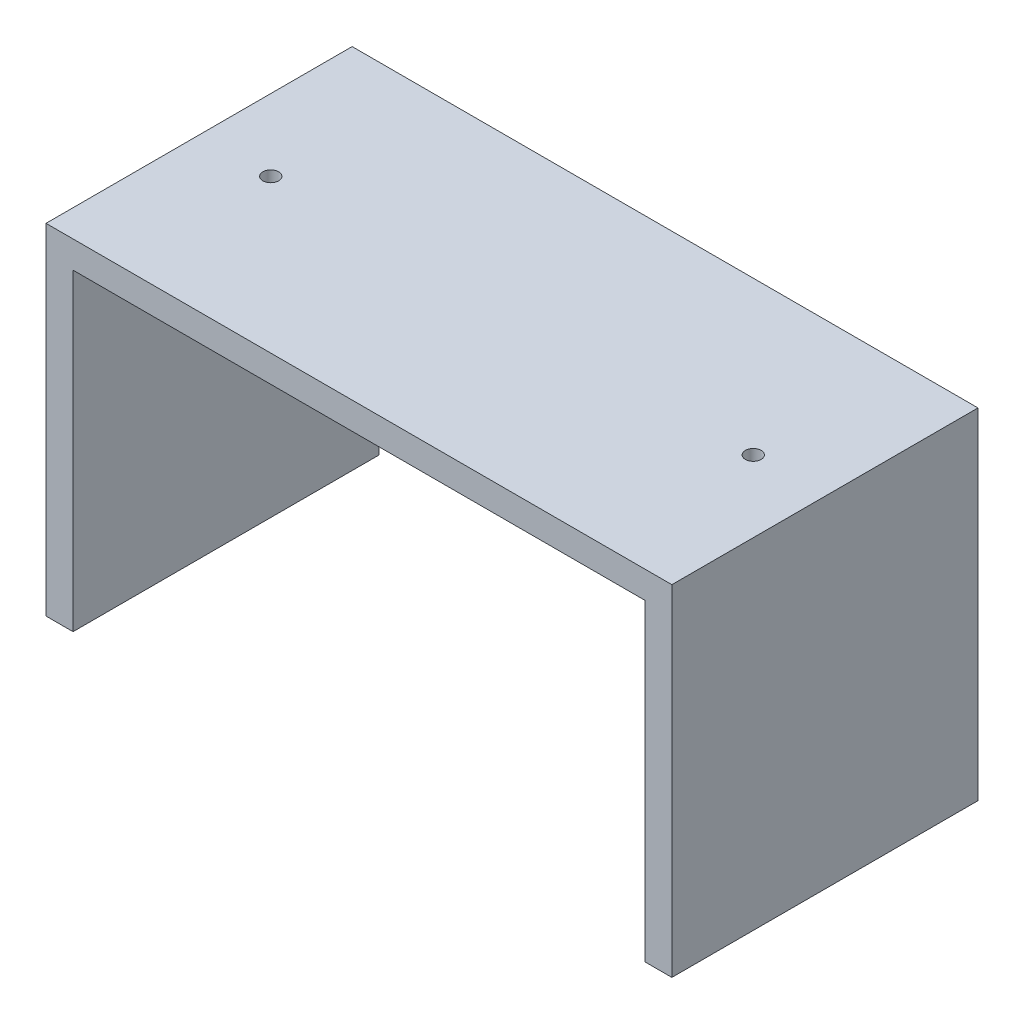
ISO-10303-21;
HEADER;
FILE_DESCRIPTION(('STEP AP214'),'2;1');
FILE_NAME('part.step','',(''),(''),'','','');
FILE_SCHEMA(('AUTOMOTIVE_DESIGN { 1 0 10303 214 1 1 1 1 }'));
ENDSEC;
DATA;
#1=APPLICATION_CONTEXT('core data for automotive mechanical design processes');
#2=APPLICATION_PROTOCOL_DEFINITION('international standard','automotive_design',2000,#1);
#3=PRODUCT_CONTEXT('',#1,'mechanical');
#4=PRODUCT('Part','Part','',(#3));
#5=PRODUCT_RELATED_PRODUCT_CATEGORY('part','',(#4));
#6=PRODUCT_DEFINITION_FORMATION('','',#4);
#7=PRODUCT_DEFINITION_CONTEXT('part definition',#1,'design');
#8=PRODUCT_DEFINITION('design','',#6,#7);
#9=PRODUCT_DEFINITION_SHAPE('','',#8);
#10=(LENGTH_UNIT() NAMED_UNIT(*) SI_UNIT(.MILLI.,.METRE.));
#11=(NAMED_UNIT(*) PLANE_ANGLE_UNIT() SI_UNIT($,.RADIAN.));
#12=(NAMED_UNIT(*) SI_UNIT($,.STERADIAN.) SOLID_ANGLE_UNIT());
#13=UNCERTAINTY_MEASURE_WITH_UNIT(LENGTH_MEASURE(1.E-05),#10,'distance_accuracy_value','');
#14=(GEOMETRIC_REPRESENTATION_CONTEXT(3) GLOBAL_UNCERTAINTY_ASSIGNED_CONTEXT((#13)) GLOBAL_UNIT_ASSIGNED_CONTEXT((#10,
#11,#12)) REPRESENTATION_CONTEXT('',''));
#15=CARTESIAN_POINT('',(0.,0.,0.));
#16=DIRECTION('',(0.,0.,1.));
#17=DIRECTION('',(1.,0.,0.));
#18=AXIS2_PLACEMENT_3D('',#15,#16,#17);
#19=CARTESIAN_POINT('',(0.,-20.,18.));
#20=DIRECTION('',(0.,1.,0.));
#21=DIRECTION('',(0.,0.,1.));
#22=AXIS2_PLACEMENT_3D('',#19,#20,#21);
#23=PLANE('',#22);
#24=DIRECTION('',(1.,0.,0.));
#25=VECTOR('',#24,1.);
#26=CARTESIAN_POINT('',(0.,-20.,0.));
#27=LINE('',#26,#25);
#28=CARTESIAN_POINT('',(0.,-20.,0.));
#29=VERTEX_POINT('',#28);
#30=CARTESIAN_POINT('',(1.59,-20.,0.));
#31=VERTEX_POINT('',#30);
#32=EDGE_CURVE('E128',#29,#31,#27,.T.);
#33=ORIENTED_EDGE('',*,*,#32,.T.);
#34=DIRECTION('',(0.,0.,-1.));
#35=VECTOR('',#34,1.);
#36=CARTESIAN_POINT('',(1.59,-20.,18.));
#37=LINE('',#36,#35);
#38=CARTESIAN_POINT('',(1.59,-20.,18.));
#39=VERTEX_POINT('',#38);
#40=EDGE_CURVE('E11',#39,#31,#37,.T.);
#41=ORIENTED_EDGE('',*,*,#40,.F.);
#42=DIRECTION('',(1.,0.,0.));
#43=VECTOR('',#42,1.);
#44=CARTESIAN_POINT('',(0.,-20.,18.));
#45=LINE('',#44,#43);
#46=CARTESIAN_POINT('',(0.,-20.,18.));
#47=VERTEX_POINT('',#46);
#48=EDGE_CURVE('E143',#47,#39,#45,.T.);
#49=ORIENTED_EDGE('',*,*,#48,.F.);
#50=DIRECTION('',(0.,0.,-1.));
#51=VECTOR('',#50,1.);
#52=CARTESIAN_POINT('',(0.,-20.,18.));
#53=LINE('',#52,#51);
#54=EDGE_CURVE('E124',#47,#29,#53,.T.);
#55=ORIENTED_EDGE('',*,*,#54,.T.);
#56=EDGE_LOOP('',(#33,#41,#49,#55));
#57=FACE_BOUND('',#56,.T.);
#58=ADVANCED_FACE('F32',(#57),#23,.F.);
#59=CARTESIAN_POINT('',(1.59,-20.,18.));
#60=DIRECTION('',(-1.,0.,0.));
#61=DIRECTION('',(0.,0.,1.));
#62=AXIS2_PLACEMENT_3D('',#59,#60,#61);
#63=PLANE('',#62);
#64=DIRECTION('',(0.,1.,0.));
#65=VECTOR('',#64,1.);
#66=CARTESIAN_POINT('',(1.59,-20.,0.));
#67=LINE('',#66,#65);
#68=CARTESIAN_POINT('',(1.59,-1.59,0.));
#69=VERTEX_POINT('',#68);
#70=EDGE_CURVE('E131',#31,#69,#67,.T.);
#71=ORIENTED_EDGE('',*,*,#70,.T.);
#72=DIRECTION('',(0.,0.,-1.));
#73=VECTOR('',#72,1.);
#74=CARTESIAN_POINT('',(1.59,-1.59,18.));
#75=LINE('',#74,#73);
#76=CARTESIAN_POINT('',(1.59,-1.59,18.));
#77=VERTEX_POINT('',#76);
#78=EDGE_CURVE('E40',#77,#69,#75,.T.);
#79=ORIENTED_EDGE('',*,*,#78,.F.);
#80=DIRECTION('',(0.,1.,0.));
#81=VECTOR('',#80,1.);
#82=CARTESIAN_POINT('',(1.59,-20.,18.));
#83=LINE('',#82,#81);
#84=EDGE_CURVE('E91',#39,#77,#83,.T.);
#85=ORIENTED_EDGE('',*,*,#84,.F.);
#86=ORIENTED_EDGE('',*,*,#40,.T.);
#87=EDGE_LOOP('',(#71,#79,#85,#86));
#88=FACE_BOUND('',#87,.T.);
#89=ADVANCED_FACE('F204',(#88),#63,.F.);
#90=CARTESIAN_POINT('',(1.59,-1.59,18.));
#91=DIRECTION('',(0.,1.,0.));
#92=DIRECTION('',(0.,0.,1.));
#93=AXIS2_PLACEMENT_3D('',#90,#91,#92);
#94=PLANE('',#93);
#95=CARTESIAN_POINT('',(32.5859,-1.59,9.));
#96=DIRECTION('',(0.,1.,0.));
#97=DIRECTION('',(0.,0.,1.));
#98=AXIS2_PLACEMENT_3D('',#95,#96,#97);
#99=CIRCLE('',#98,0.463549999999997);
#100=CARTESIAN_POINT('',(32.5859,-1.59,9.46355));
#101=VERTEX_POINT('',#100);
#102=EDGE_CURVE('E181',#101,#101,#99,.T.);
#103=ORIENTED_EDGE('',*,*,#102,.T.);
#104=EDGE_LOOP('',(#103));
#105=FACE_BOUND('',#104,.T.);
#106=CARTESIAN_POINT('',(4.2141,-1.59,9.));
#107=DIRECTION('',(0.,1.,0.));
#108=DIRECTION('',(0.,0.,1.));
#109=AXIS2_PLACEMENT_3D('',#106,#107,#108);
#110=CIRCLE('',#109,0.46355);
#111=CARTESIAN_POINT('',(4.2141,-1.59,9.46355));
#112=VERTEX_POINT('',#111);
#113=EDGE_CURVE('E132',#112,#112,#110,.T.);
#114=ORIENTED_EDGE('',*,*,#113,.T.);
#115=EDGE_LOOP('',(#114));
#116=FACE_BOUND('',#115,.T.);
#117=DIRECTION('',(1.,0.,0.));
#118=VECTOR('',#117,1.);
#119=CARTESIAN_POINT('',(1.59,-1.59,0.));
#120=LINE('',#119,#118);
#121=CARTESIAN_POINT('',(35.21,-1.59,0.));
#122=VERTEX_POINT('',#121);
#123=EDGE_CURVE('E134',#69,#122,#120,.T.);
#124=ORIENTED_EDGE('',*,*,#123,.T.);
#125=DIRECTION('',(0.,0.,-1.));
#126=VECTOR('',#125,1.);
#127=CARTESIAN_POINT('',(35.21,-1.59,18.));
#128=LINE('',#127,#126);
#129=CARTESIAN_POINT('',(35.21,-1.59,18.));
#130=VERTEX_POINT('',#129);
#131=EDGE_CURVE('E150',#130,#122,#128,.T.);
#132=ORIENTED_EDGE('',*,*,#131,.F.);
#133=DIRECTION('',(1.,0.,0.));
#134=VECTOR('',#133,1.);
#135=CARTESIAN_POINT('',(1.59,-1.59,18.));
#136=LINE('',#135,#134);
#137=EDGE_CURVE('E158',#77,#130,#136,.T.);
#138=ORIENTED_EDGE('',*,*,#137,.F.);
#139=ORIENTED_EDGE('',*,*,#78,.T.);
#140=EDGE_LOOP('',(#124,#132,#138,#139));
#141=FACE_BOUND('',#140,.T.);
#142=ADVANCED_FACE('F156',(#105,#116,#141),#94,.F.);
#143=CARTESIAN_POINT('',(35.21,-1.59,18.));
#144=DIRECTION('',(1.,0.,0.));
#145=DIRECTION('',(0.,0.,-1.));
#146=AXIS2_PLACEMENT_3D('',#143,#144,#145);
#147=PLANE('',#146);
#148=DIRECTION('',(0.,-1.,0.));
#149=VECTOR('',#148,1.);
#150=CARTESIAN_POINT('',(35.21,-1.59,0.));
#151=LINE('',#150,#149);
#152=CARTESIAN_POINT('',(35.21,-20.,0.));
#153=VERTEX_POINT('',#152);
#154=EDGE_CURVE('E136',#122,#153,#151,.T.);
#155=ORIENTED_EDGE('',*,*,#154,.T.);
#156=DIRECTION('',(0.,0.,-1.));
#157=VECTOR('',#156,1.);
#158=CARTESIAN_POINT('',(35.21,-20.,18.));
#159=LINE('',#158,#157);
#160=CARTESIAN_POINT('',(35.21,-20.,18.));
#161=VERTEX_POINT('',#160);
#162=EDGE_CURVE('E147',#161,#153,#159,.T.);
#163=ORIENTED_EDGE('',*,*,#162,.F.);
#164=DIRECTION('',(0.,-1.,0.));
#165=VECTOR('',#164,1.);
#166=CARTESIAN_POINT('',(35.21,-1.59,18.));
#167=LINE('',#166,#165);
#168=EDGE_CURVE('E170',#130,#161,#167,.T.);
#169=ORIENTED_EDGE('',*,*,#168,.F.);
#170=ORIENTED_EDGE('',*,*,#131,.T.);
#171=EDGE_LOOP('',(#155,#163,#169,#170));
#172=FACE_BOUND('',#171,.T.);
#173=ADVANCED_FACE('F166',(#172),#147,.F.);
#174=CARTESIAN_POINT('',(35.21,-20.,18.));
#175=DIRECTION('',(0.,1.,0.));
#176=DIRECTION('',(0.,0.,1.));
#177=AXIS2_PLACEMENT_3D('',#174,#175,#176);
#178=PLANE('',#177);
#179=DIRECTION('',(1.,0.,0.));
#180=VECTOR('',#179,1.);
#181=CARTESIAN_POINT('',(35.21,-20.,0.));
#182=LINE('',#181,#180);
#183=CARTESIAN_POINT('',(36.8,-20.,0.));
#184=VERTEX_POINT('',#183);
#185=EDGE_CURVE('E138',#153,#184,#182,.T.);
#186=ORIENTED_EDGE('',*,*,#185,.T.);
#187=DIRECTION('',(0.,0.,-1.));
#188=VECTOR('',#187,1.);
#189=CARTESIAN_POINT('',(36.8,-20.,18.));
#190=LINE('',#189,#188);
#191=CARTESIAN_POINT('',(36.8,-20.,18.));
#192=VERTEX_POINT('',#191);
#193=EDGE_CURVE('E119',#192,#184,#190,.T.);
#194=ORIENTED_EDGE('',*,*,#193,.F.);
#195=DIRECTION('',(1.,0.,0.));
#196=VECTOR('',#195,1.);
#197=CARTESIAN_POINT('',(35.21,-20.,18.));
#198=LINE('',#197,#196);
#199=EDGE_CURVE('E110',#161,#192,#198,.T.);
#200=ORIENTED_EDGE('',*,*,#199,.F.);
#201=ORIENTED_EDGE('',*,*,#162,.T.);
#202=EDGE_LOOP('',(#186,#194,#200,#201));
#203=FACE_BOUND('',#202,.T.);
#204=ADVANCED_FACE('F169',(#203),#178,.F.);
#205=CARTESIAN_POINT('',(36.8,0.,18.));
#206=DIRECTION('',(-1.,0.,0.));
#207=DIRECTION('',(0.,0.,1.));
#208=AXIS2_PLACEMENT_3D('',#205,#206,#207);
#209=PLANE('',#208);
#210=DIRECTION('',(0.,1.,0.));
#211=VECTOR('',#210,1.);
#212=CARTESIAN_POINT('',(36.8,0.,0.));
#213=LINE('',#212,#211);
#214=CARTESIAN_POINT('',(36.8,0.,0.));
#215=VERTEX_POINT('',#214);
#216=EDGE_CURVE('E118',#184,#215,#213,.T.);
#217=ORIENTED_EDGE('',*,*,#216,.T.);
#218=DIRECTION('',(0.,0.,-1.));
#219=VECTOR('',#218,1.);
#220=CARTESIAN_POINT('',(36.8,0.,18.));
#221=LINE('',#220,#219);
#222=CARTESIAN_POINT('',(36.8,0.,18.));
#223=VERTEX_POINT('',#222);
#224=EDGE_CURVE('E115',#223,#215,#221,.T.);
#225=ORIENTED_EDGE('',*,*,#224,.F.);
#226=DIRECTION('',(0.,1.,0.));
#227=VECTOR('',#226,1.);
#228=CARTESIAN_POINT('',(36.8,0.,18.));
#229=LINE('',#228,#227);
#230=EDGE_CURVE('E104',#192,#223,#229,.T.);
#231=ORIENTED_EDGE('',*,*,#230,.F.);
#232=ORIENTED_EDGE('',*,*,#193,.T.);
#233=EDGE_LOOP('',(#217,#225,#231,#232));
#234=FACE_BOUND('',#233,.T.);
#235=ADVANCED_FACE('F116',(#234),#209,.F.);
#236=CARTESIAN_POINT('',(0.,0.,18.));
#237=DIRECTION('',(0.,-1.,0.));
#238=DIRECTION('',(0.,0.,-1.));
#239=AXIS2_PLACEMENT_3D('',#236,#237,#238);
#240=PLANE('',#239);
#241=CARTESIAN_POINT('',(32.5859,0.,9.));
#242=DIRECTION('',(0.,1.,0.));
#243=DIRECTION('',(0.,0.,1.));
#244=AXIS2_PLACEMENT_3D('',#241,#242,#243);
#245=CIRCLE('',#244,0.463549999999997);
#246=CARTESIAN_POINT('',(32.5859,0.,9.46355));
#247=VERTEX_POINT('',#246);
#248=EDGE_CURVE('E184',#247,#247,#245,.T.);
#249=ORIENTED_EDGE('',*,*,#248,.F.);
#250=EDGE_LOOP('',(#249));
#251=FACE_BOUND('',#250,.T.);
#252=CARTESIAN_POINT('',(4.2141,0.,9.));
#253=DIRECTION('',(0.,1.,0.));
#254=DIRECTION('',(0.,0.,1.));
#255=AXIS2_PLACEMENT_3D('',#252,#253,#254);
#256=CIRCLE('',#255,0.46355);
#257=CARTESIAN_POINT('',(4.2141,0.,9.46355));
#258=VERTEX_POINT('',#257);
#259=EDGE_CURVE('E178',#258,#258,#256,.T.);
#260=ORIENTED_EDGE('',*,*,#259,.F.);
#261=EDGE_LOOP('',(#260));
#262=FACE_BOUND('',#261,.T.);
#263=DIRECTION('',(-1.,0.,0.));
#264=VECTOR('',#263,1.);
#265=CARTESIAN_POINT('',(0.,0.,0.));
#266=LINE('',#265,#264);
#267=CARTESIAN_POINT('',(0.,0.,0.));
#268=VERTEX_POINT('',#267);
#269=EDGE_CURVE('E77',#215,#268,#266,.T.);
#270=ORIENTED_EDGE('',*,*,#269,.T.);
#271=DIRECTION('',(0.,0.,-1.));
#272=VECTOR('',#271,1.);
#273=CARTESIAN_POINT('',(0.,0.,18.));
#274=LINE('',#273,#272);
#275=CARTESIAN_POINT('',(0.,0.,18.));
#276=VERTEX_POINT('',#275);
#277=EDGE_CURVE('E120',#276,#268,#274,.T.);
#278=ORIENTED_EDGE('',*,*,#277,.F.);
#279=DIRECTION('',(-1.,0.,0.));
#280=VECTOR('',#279,1.);
#281=CARTESIAN_POINT('',(0.,0.,18.));
#282=LINE('',#281,#280);
#283=EDGE_CURVE('E108',#223,#276,#282,.T.);
#284=ORIENTED_EDGE('',*,*,#283,.F.);
#285=ORIENTED_EDGE('',*,*,#224,.T.);
#286=EDGE_LOOP('',(#270,#278,#284,#285));
#287=FACE_BOUND('',#286,.T.);
#288=ADVANCED_FACE('F122',(#251,#262,#287),#240,.F.);
#289=CARTESIAN_POINT('',(0.,-20.,18.));
#290=DIRECTION('',(1.,0.,0.));
#291=DIRECTION('',(0.,0.,-1.));
#292=AXIS2_PLACEMENT_3D('',#289,#290,#291);
#293=PLANE('',#292);
#294=DIRECTION('',(0.,-1.,0.));
#295=VECTOR('',#294,1.);
#296=CARTESIAN_POINT('',(0.,-20.,0.));
#297=LINE('',#296,#295);
#298=EDGE_CURVE('E83',#268,#29,#297,.T.);
#299=ORIENTED_EDGE('',*,*,#298,.T.);
#300=ORIENTED_EDGE('',*,*,#54,.F.);
#301=DIRECTION('',(0.,-1.,0.));
#302=VECTOR('',#301,1.);
#303=CARTESIAN_POINT('',(0.,-20.,18.));
#304=LINE('',#303,#302);
#305=EDGE_CURVE('E48',#276,#47,#304,.T.);
#306=ORIENTED_EDGE('',*,*,#305,.F.);
#307=ORIENTED_EDGE('',*,*,#277,.T.);
#308=EDGE_LOOP('',(#299,#300,#306,#307));
#309=FACE_BOUND('',#308,.T.);
#310=ADVANCED_FACE('F193',(#309),#293,.F.);
#311=CARTESIAN_POINT('',(0.,0.,18.));
#312=DIRECTION('',(0.,0.,1.));
#313=DIRECTION('',(1.,0.,0.));
#314=AXIS2_PLACEMENT_3D('',#311,#312,#313);
#315=PLANE('',#314);
#316=ORIENTED_EDGE('',*,*,#48,.T.);
#317=ORIENTED_EDGE('',*,*,#84,.T.);
#318=ORIENTED_EDGE('',*,*,#137,.T.);
#319=ORIENTED_EDGE('',*,*,#168,.T.);
#320=ORIENTED_EDGE('',*,*,#199,.T.);
#321=ORIENTED_EDGE('',*,*,#230,.T.);
#322=ORIENTED_EDGE('',*,*,#283,.T.);
#323=ORIENTED_EDGE('',*,*,#305,.T.);
#324=EDGE_LOOP('',(#316,#317,#318,#319,#320,#321,#322,#323));
#325=FACE_BOUND('',#324,.T.);
#326=ADVANCED_FACE('F106',(#325),#315,.T.);
#327=CARTESIAN_POINT('',(0.,0.,0.));
#328=DIRECTION('',(0.,0.,1.));
#329=DIRECTION('',(1.,0.,0.));
#330=AXIS2_PLACEMENT_3D('',#327,#328,#329);
#331=PLANE('',#330);
#332=ORIENTED_EDGE('',*,*,#32,.F.);
#333=ORIENTED_EDGE('',*,*,#298,.F.);
#334=ORIENTED_EDGE('',*,*,#269,.F.);
#335=ORIENTED_EDGE('',*,*,#216,.F.);
#336=ORIENTED_EDGE('',*,*,#185,.F.);
#337=ORIENTED_EDGE('',*,*,#154,.F.);
#338=ORIENTED_EDGE('',*,*,#123,.F.);
#339=ORIENTED_EDGE('',*,*,#70,.F.);
#340=EDGE_LOOP('',(#332,#333,#334,#335,#336,#337,#338,#339));
#341=FACE_BOUND('',#340,.T.);
#342=ADVANCED_FACE('F162',(#341),#331,.F.);
#343=CARTESIAN_POINT('',(4.2141,-10.,9.));
#344=DIRECTION('',(0.,1.,0.));
#345=DIRECTION('',(0.,0.,1.));
#346=AXIS2_PLACEMENT_3D('',#343,#344,#345);
#347=CYLINDRICAL_SURFACE('',#346,0.46355);
#348=ORIENTED_EDGE('',*,*,#259,.T.);
#349=EDGE_LOOP('',(#348));
#350=FACE_BOUND('',#349,.T.);
#351=ORIENTED_EDGE('',*,*,#113,.F.);
#352=EDGE_LOOP('',(#351));
#353=FACE_BOUND('',#352,.T.);
#354=ADVANCED_FACE('F197',(#350,#353),#347,.F.);
#355=CARTESIAN_POINT('',(32.5859,-10.,9.));
#356=DIRECTION('',(0.,1.,0.));
#357=DIRECTION('',(0.,0.,1.));
#358=AXIS2_PLACEMENT_3D('',#355,#356,#357);
#359=CYLINDRICAL_SURFACE('',#358,0.463549999999997);
#360=ORIENTED_EDGE('',*,*,#248,.T.);
#361=EDGE_LOOP('',(#360));
#362=FACE_BOUND('',#361,.T.);
#363=ORIENTED_EDGE('',*,*,#102,.F.);
#364=EDGE_LOOP('',(#363));
#365=FACE_BOUND('',#364,.T.);
#366=ADVANCED_FACE('F188',(#362,#365),#359,.F.);
#367=CLOSED_SHELL('',(#58,#89,#142,#173,#204,#235,#288,#310,#326,#342,#354,#366));
#368=MANIFOLD_SOLID_BREP('B2',#367);
#369=ADVANCED_BREP_SHAPE_REPRESENTATION('',(#18,#368),#14);
#370=SHAPE_DEFINITION_REPRESENTATION(#9,#369);
ENDSEC;
END-ISO-10303-21;
